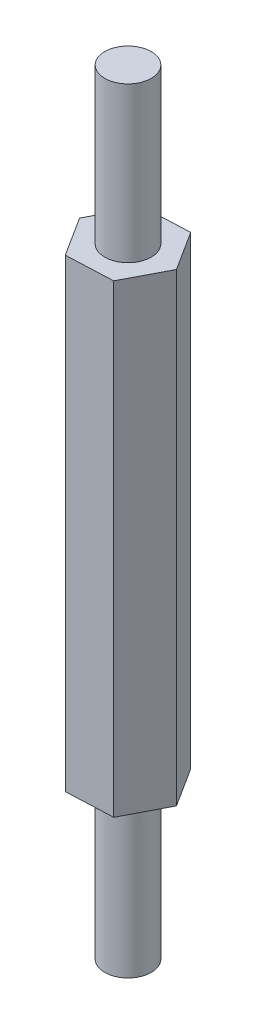
ISO-10303-21;
HEADER;
FILE_DESCRIPTION(('STEP AP214'),'2;1');
FILE_NAME('part.step','',(''),(''),'','','');
FILE_SCHEMA(('AUTOMOTIVE_DESIGN { 1 0 10303 214 1 1 1 1 }'));
ENDSEC;
DATA;
#1=APPLICATION_CONTEXT('core data for automotive mechanical design processes');
#2=APPLICATION_PROTOCOL_DEFINITION('international standard','automotive_design',2000,#1);
#3=PRODUCT_CONTEXT('',#1,'mechanical');
#4=PRODUCT('Part','Part','',(#3));
#5=PRODUCT_RELATED_PRODUCT_CATEGORY('part','',(#4));
#6=PRODUCT_DEFINITION_FORMATION('','',#4);
#7=PRODUCT_DEFINITION_CONTEXT('part definition',#1,'design');
#8=PRODUCT_DEFINITION('design','',#6,#7);
#9=PRODUCT_DEFINITION_SHAPE('','',#8);
#10=(LENGTH_UNIT() NAMED_UNIT(*) SI_UNIT(.MILLI.,.METRE.));
#11=(NAMED_UNIT(*) PLANE_ANGLE_UNIT() SI_UNIT($,.RADIAN.));
#12=(NAMED_UNIT(*) SI_UNIT($,.STERADIAN.) SOLID_ANGLE_UNIT());
#13=UNCERTAINTY_MEASURE_WITH_UNIT(LENGTH_MEASURE(1.E-05),#10,'distance_accuracy_value','');
#14=(GEOMETRIC_REPRESENTATION_CONTEXT(3) GLOBAL_UNCERTAINTY_ASSIGNED_CONTEXT((#13)) GLOBAL_UNIT_ASSIGNED_CONTEXT((#10,
#11,#12)) REPRESENTATION_CONTEXT('',''));
#15=CARTESIAN_POINT('',(0.,0.,0.));
#16=DIRECTION('',(0.,0.,1.));
#17=DIRECTION('',(1.,0.,0.));
#18=AXIS2_PLACEMENT_3D('',#15,#16,#17);
#19=CARTESIAN_POINT('',(0.,0.,0.));
#20=DIRECTION('',(0.,1.,0.));
#21=DIRECTION('',(0.,0.,1.));
#22=AXIS2_PLACEMENT_3D('',#19,#20,#21);
#23=PLANE('',#22);
#24=DIRECTION('',(-0.536521996042108,0.,-0.843886335807727));
#25=VECTOR('',#24,1.);
#26=CARTESIAN_POINT('',(3.,0.,-0.12821246048624));
#27=LINE('',#26,#25);
#28=CARTESIAN_POINT('',(3.,0.,-0.12821246048624));
#29=VERTEX_POINT('',#28);
#30=CARTESIAN_POINT('',(1.38896475213721,0.,-2.66218244159644));
#31=VERTEX_POINT('',#30);
#32=EDGE_CURVE('E119',#29,#31,#27,.T.);
#33=ORIENTED_EDGE('',*,*,#32,.F.);
#34=DIRECTION('',(0.462566006695003,0.,-0.886584846165463));
#35=VECTOR('',#34,1.);
#36=CARTESIAN_POINT('',(1.61103524786279,0.,2.5339699811102));
#37=LINE('',#36,#35);
#38=CARTESIAN_POINT('',(1.61103524786279,0.,2.5339699811102));
#39=VERTEX_POINT('',#38);
#40=EDGE_CURVE('E78',#39,#29,#37,.T.);
#41=ORIENTED_EDGE('',*,*,#40,.F.);
#42=DIRECTION('',(0.999088002737111,0.,-0.0426985103577362));
#43=VECTOR('',#42,1.);
#44=CARTESIAN_POINT('',(-1.38896475213721,0.,2.66218244159644));
#45=LINE('',#44,#43);
#46=CARTESIAN_POINT('',(-1.38896475213721,0.,2.66218244159644));
#47=VERTEX_POINT('',#46);
#48=EDGE_CURVE('E72',#47,#39,#45,.T.);
#49=ORIENTED_EDGE('',*,*,#48,.F.);
#50=DIRECTION('',(0.536521996042108,0.,0.843886335807727));
#51=VECTOR('',#50,1.);
#52=CARTESIAN_POINT('',(-3.,0.,0.12821246048624));
#53=LINE('',#52,#51);
#54=CARTESIAN_POINT('',(-3.,0.,0.12821246048624));
#55=VERTEX_POINT('',#54);
#56=EDGE_CURVE('E109',#55,#47,#53,.T.);
#57=ORIENTED_EDGE('',*,*,#56,.F.);
#58=DIRECTION('',(-0.462566006695003,0.,0.886584846165463));
#59=VECTOR('',#58,1.);
#60=CARTESIAN_POINT('',(-1.61103524786279,0.,-2.5339699811102));
#61=LINE('',#60,#59);
#62=CARTESIAN_POINT('',(-1.61103524786279,0.,-2.5339699811102));
#63=VERTEX_POINT('',#62);
#64=EDGE_CURVE('E125',#63,#55,#61,.T.);
#65=ORIENTED_EDGE('',*,*,#64,.F.);
#66=DIRECTION('',(-0.999088002737111,0.,0.0426985103577361));
#67=VECTOR('',#66,1.);
#68=CARTESIAN_POINT('',(1.38896475213721,0.,-2.66218244159644));
#69=LINE('',#68,#67);
#70=EDGE_CURVE('E122',#31,#63,#69,.T.);
#71=ORIENTED_EDGE('',*,*,#70,.F.);
#72=EDGE_LOOP('',(#33,#41,#49,#57,#65,#71));
#73=FACE_BOUND('',#72,.T.);
#74=CARTESIAN_POINT('',(0.,0.,0.));
#75=DIRECTION('',(0.,1.,0.));
#76=DIRECTION('',(0.,0.,1.));
#77=AXIS2_PLACEMENT_3D('',#74,#75,#76);
#78=CIRCLE('',#77,1.5);
#79=CARTESIAN_POINT('',(0.,0.,1.5));
#80=VERTEX_POINT('',#79);
#81=EDGE_CURVE('E11',#80,#80,#78,.F.);
#82=ORIENTED_EDGE('',*,*,#81,.F.);
#83=EDGE_LOOP('',(#82));
#84=FACE_BOUND('',#83,.T.);
#85=ADVANCED_FACE('F32',(#73,#84),#23,.F.);
#86=CARTESIAN_POINT('',(0.,30.,0.));
#87=DIRECTION('',(0.,1.,0.));
#88=DIRECTION('',(0.,0.,1.));
#89=AXIS2_PLACEMENT_3D('',#86,#87,#88);
#90=PLANE('',#89);
#91=DIRECTION('',(-0.536521996042108,0.,-0.843886335807727));
#92=VECTOR('',#91,1.);
#93=CARTESIAN_POINT('',(3.,30.,-0.12821246048624));
#94=LINE('',#93,#92);
#95=CARTESIAN_POINT('',(3.,30.,-0.12821246048624));
#96=VERTEX_POINT('',#95);
#97=CARTESIAN_POINT('',(1.38896475213721,30.,-2.66218244159644));
#98=VERTEX_POINT('',#97);
#99=EDGE_CURVE('E130',#96,#98,#94,.T.);
#100=ORIENTED_EDGE('',*,*,#99,.T.);
#101=DIRECTION('',(-0.999088002737111,0.,0.0426985103577361));
#102=VECTOR('',#101,1.);
#103=CARTESIAN_POINT('',(1.38896475213721,30.,-2.66218244159644));
#104=LINE('',#103,#102);
#105=CARTESIAN_POINT('',(-1.61103524786279,30.,-2.5339699811102));
#106=VERTEX_POINT('',#105);
#107=EDGE_CURVE('E87',#98,#106,#104,.T.);
#108=ORIENTED_EDGE('',*,*,#107,.T.);
#109=DIRECTION('',(-0.462566006695003,0.,0.886584846165463));
#110=VECTOR('',#109,1.);
#111=CARTESIAN_POINT('',(-1.61103524786279,30.,-2.5339699811102));
#112=LINE('',#111,#110);
#113=CARTESIAN_POINT('',(-3.,30.,0.12821246048624));
#114=VERTEX_POINT('',#113);
#115=EDGE_CURVE('E101',#106,#114,#112,.T.);
#116=ORIENTED_EDGE('',*,*,#115,.T.);
#117=DIRECTION('',(0.536521996042108,0.,0.843886335807727));
#118=VECTOR('',#117,1.);
#119=CARTESIAN_POINT('',(-3.,30.,0.12821246048624));
#120=LINE('',#119,#118);
#121=CARTESIAN_POINT('',(-1.38896475213721,30.,2.66218244159644));
#122=VERTEX_POINT('',#121);
#123=EDGE_CURVE('E94',#114,#122,#120,.T.);
#124=ORIENTED_EDGE('',*,*,#123,.T.);
#125=DIRECTION('',(0.999088002737111,0.,-0.0426985103577362));
#126=VECTOR('',#125,1.);
#127=CARTESIAN_POINT('',(-1.38896475213721,30.,2.66218244159644));
#128=LINE('',#127,#126);
#129=CARTESIAN_POINT('',(1.61103524786279,30.,2.5339699811102));
#130=VERTEX_POINT('',#129);
#131=EDGE_CURVE('E99',#122,#130,#128,.T.);
#132=ORIENTED_EDGE('',*,*,#131,.T.);
#133=DIRECTION('',(0.462566006695003,0.,-0.886584846165463));
#134=VECTOR('',#133,1.);
#135=CARTESIAN_POINT('',(1.61103524786279,30.,2.5339699811102));
#136=LINE('',#135,#134);
#137=EDGE_CURVE('E49',#130,#96,#136,.T.);
#138=ORIENTED_EDGE('',*,*,#137,.T.);
#139=EDGE_LOOP('',(#100,#108,#116,#124,#132,#138));
#140=FACE_BOUND('',#139,.T.);
#141=CARTESIAN_POINT('',(0.,30.,0.));
#142=DIRECTION('',(0.,1.,0.));
#143=DIRECTION('',(0.,0.,1.));
#144=AXIS2_PLACEMENT_3D('',#141,#142,#143);
#145=CIRCLE('',#144,1.5);
#146=CARTESIAN_POINT('',(0.,30.,1.5));
#147=VERTEX_POINT('',#146);
#148=EDGE_CURVE('E149',#147,#147,#145,.T.);
#149=ORIENTED_EDGE('',*,*,#148,.F.);
#150=EDGE_LOOP('',(#149));
#151=FACE_BOUND('',#150,.T.);
#152=ADVANCED_FACE('F96',(#140,#151),#90,.T.);
#153=CARTESIAN_POINT('',(3.,30.,-0.12821246048624));
#154=DIRECTION('',(-0.843886335807727,0.,0.536521996042108));
#155=DIRECTION('',(0.536521996042108,0.,0.843886335807727));
#156=AXIS2_PLACEMENT_3D('',#153,#154,#155);
#157=PLANE('',#156);
#158=ORIENTED_EDGE('',*,*,#32,.T.);
#159=DIRECTION('',(0.,-1.,0.));
#160=VECTOR('',#159,1.);
#161=CARTESIAN_POINT('',(1.38896475213721,30.,-2.66218244159644));
#162=LINE('',#161,#160);
#163=EDGE_CURVE('E41',#98,#31,#162,.T.);
#164=ORIENTED_EDGE('',*,*,#163,.F.);
#165=ORIENTED_EDGE('',*,*,#99,.F.);
#166=DIRECTION('',(0.,-1.,0.));
#167=VECTOR('',#166,1.);
#168=CARTESIAN_POINT('',(3.,30.,-0.12821246048624));
#169=LINE('',#168,#167);
#170=EDGE_CURVE('E115',#96,#29,#169,.T.);
#171=ORIENTED_EDGE('',*,*,#170,.T.);
#172=EDGE_LOOP('',(#158,#164,#165,#171));
#173=FACE_BOUND('',#172,.T.);
#174=ADVANCED_FACE('F34',(#173),#157,.F.);
#175=CARTESIAN_POINT('',(1.38896475213721,30.,-2.66218244159644));
#176=DIRECTION('',(0.0426985103577361,0.,0.999088002737112));
#177=DIRECTION('',(0.999088002737112,0.,-0.0426985103577361));
#178=AXIS2_PLACEMENT_3D('',#175,#176,#177);
#179=PLANE('',#178);
#180=ORIENTED_EDGE('',*,*,#70,.T.);
#181=DIRECTION('',(0.,-1.,0.));
#182=VECTOR('',#181,1.);
#183=CARTESIAN_POINT('',(-1.61103524786279,30.,-2.5339699811102));
#184=LINE('',#183,#182);
#185=EDGE_CURVE('E134',#106,#63,#184,.T.);
#186=ORIENTED_EDGE('',*,*,#185,.F.);
#187=ORIENTED_EDGE('',*,*,#107,.F.);
#188=ORIENTED_EDGE('',*,*,#163,.T.);
#189=EDGE_LOOP('',(#180,#186,#187,#188));
#190=FACE_BOUND('',#189,.T.);
#191=ADVANCED_FACE('F137',(#190),#179,.F.);
#192=CARTESIAN_POINT('',(-1.61103524786279,30.,-2.5339699811102));
#193=DIRECTION('',(0.886584846165463,0.,0.462566006695003));
#194=DIRECTION('',(0.462566006695003,0.,-0.886584846165464));
#195=AXIS2_PLACEMENT_3D('',#192,#193,#194);
#196=PLANE('',#195);
#197=ORIENTED_EDGE('',*,*,#64,.T.);
#198=DIRECTION('',(0.,-1.,0.));
#199=VECTOR('',#198,1.);
#200=CARTESIAN_POINT('',(-3.,30.,0.12821246048624));
#201=LINE('',#200,#199);
#202=EDGE_CURVE('E110',#114,#55,#201,.T.);
#203=ORIENTED_EDGE('',*,*,#202,.F.);
#204=ORIENTED_EDGE('',*,*,#115,.F.);
#205=ORIENTED_EDGE('',*,*,#185,.T.);
#206=EDGE_LOOP('',(#197,#203,#204,#205));
#207=FACE_BOUND('',#206,.T.);
#208=ADVANCED_FACE('F145',(#207),#196,.F.);
#209=CARTESIAN_POINT('',(-3.,30.,0.12821246048624));
#210=DIRECTION('',(0.843886335807727,0.,-0.536521996042108));
#211=DIRECTION('',(-0.536521996042108,0.,-0.843886335807727));
#212=AXIS2_PLACEMENT_3D('',#209,#210,#211);
#213=PLANE('',#212);
#214=ORIENTED_EDGE('',*,*,#56,.T.);
#215=DIRECTION('',(0.,-1.,0.));
#216=VECTOR('',#215,1.);
#217=CARTESIAN_POINT('',(-1.38896475213721,30.,2.66218244159644));
#218=LINE('',#217,#216);
#219=EDGE_CURVE('E106',#122,#47,#218,.T.);
#220=ORIENTED_EDGE('',*,*,#219,.F.);
#221=ORIENTED_EDGE('',*,*,#123,.F.);
#222=ORIENTED_EDGE('',*,*,#202,.T.);
#223=EDGE_LOOP('',(#214,#220,#221,#222));
#224=FACE_BOUND('',#223,.T.);
#225=ADVANCED_FACE('F107',(#224),#213,.F.);
#226=CARTESIAN_POINT('',(-1.38896475213721,30.,2.66218244159644));
#227=DIRECTION('',(-0.0426985103577362,0.,-0.999088002737111));
#228=DIRECTION('',(-0.999088002737111,0.,0.0426985103577362));
#229=AXIS2_PLACEMENT_3D('',#226,#227,#228);
#230=PLANE('',#229);
#231=ORIENTED_EDGE('',*,*,#48,.T.);
#232=DIRECTION('',(0.,-1.,0.));
#233=VECTOR('',#232,1.);
#234=CARTESIAN_POINT('',(1.61103524786279,30.,2.5339699811102));
#235=LINE('',#234,#233);
#236=EDGE_CURVE('E111',#130,#39,#235,.T.);
#237=ORIENTED_EDGE('',*,*,#236,.F.);
#238=ORIENTED_EDGE('',*,*,#131,.F.);
#239=ORIENTED_EDGE('',*,*,#219,.T.);
#240=EDGE_LOOP('',(#231,#237,#238,#239));
#241=FACE_BOUND('',#240,.T.);
#242=ADVANCED_FACE('F113',(#241),#230,.F.);
#243=CARTESIAN_POINT('',(1.61103524786279,30.,2.5339699811102));
#244=DIRECTION('',(-0.886584846165463,0.,-0.462566006695003));
#245=DIRECTION('',(-0.462566006695003,0.,0.886584846165463));
#246=AXIS2_PLACEMENT_3D('',#243,#244,#245);
#247=PLANE('',#246);
#248=ORIENTED_EDGE('',*,*,#40,.T.);
#249=ORIENTED_EDGE('',*,*,#170,.F.);
#250=ORIENTED_EDGE('',*,*,#137,.F.);
#251=ORIENTED_EDGE('',*,*,#236,.T.);
#252=EDGE_LOOP('',(#248,#249,#250,#251));
#253=FACE_BOUND('',#252,.T.);
#254=ADVANCED_FACE('F174',(#253),#247,.F.);
#255=CARTESIAN_POINT('',(0.,40.,0.));
#256=DIRECTION('',(0.,-1.,0.));
#257=DIRECTION('',(0.,0.,-1.));
#258=AXIS2_PLACEMENT_3D('',#255,#256,#257);
#259=CYLINDRICAL_SURFACE('',#258,1.5);
#260=CARTESIAN_POINT('',(0.,40.,0.));
#261=DIRECTION('',(0.,1.,0.));
#262=DIRECTION('',(0.,0.,1.));
#263=AXIS2_PLACEMENT_3D('',#260,#261,#262);
#264=CIRCLE('',#263,1.5);
#265=CARTESIAN_POINT('',(0.,40.,1.5));
#266=VERTEX_POINT('',#265);
#267=EDGE_CURVE('E123',#266,#266,#264,.T.);
#268=ORIENTED_EDGE('',*,*,#267,.F.);
#269=EDGE_LOOP('',(#268));
#270=FACE_BOUND('',#269,.T.);
#271=ORIENTED_EDGE('',*,*,#148,.T.);
#272=EDGE_LOOP('',(#271));
#273=FACE_BOUND('',#272,.T.);
#274=ADVANCED_FACE('F177',(#270,#273),#259,.T.);
#275=CARTESIAN_POINT('',(0.,40.,0.));
#276=DIRECTION('',(0.,1.,0.));
#277=DIRECTION('',(0.,0.,1.));
#278=AXIS2_PLACEMENT_3D('',#275,#276,#277);
#279=PLANE('',#278);
#280=ORIENTED_EDGE('',*,*,#267,.T.);
#281=EDGE_LOOP('',(#280));
#282=FACE_BOUND('',#281,.T.);
#283=ADVANCED_FACE('F163',(#282),#279,.T.);
#284=CARTESIAN_POINT('',(0.,-10.,0.));
#285=DIRECTION('',(0.,1.,0.));
#286=DIRECTION('',(0.,0.,1.));
#287=AXIS2_PLACEMENT_3D('',#284,#285,#286);
#288=CYLINDRICAL_SURFACE('',#287,1.5);
#289=CARTESIAN_POINT('',(0.,-10.,0.));
#290=DIRECTION('',(0.,-1.,0.));
#291=DIRECTION('',(0.,0.,-1.));
#292=AXIS2_PLACEMENT_3D('',#289,#290,#291);
#293=CIRCLE('',#292,1.5);
#294=CARTESIAN_POINT('',(0.,-10.,-1.5));
#295=VERTEX_POINT('',#294);
#296=EDGE_CURVE('E152',#295,#295,#293,.T.);
#297=ORIENTED_EDGE('',*,*,#296,.F.);
#298=EDGE_LOOP('',(#297));
#299=FACE_BOUND('',#298,.T.);
#300=ORIENTED_EDGE('',*,*,#81,.T.);
#301=EDGE_LOOP('',(#300));
#302=FACE_BOUND('',#301,.T.);
#303=ADVANCED_FACE('F160',(#299,#302),#288,.T.);
#304=CARTESIAN_POINT('',(0.,-10.,0.));
#305=DIRECTION('',(0.,-1.,0.));
#306=DIRECTION('',(0.,0.,-1.));
#307=AXIS2_PLACEMENT_3D('',#304,#305,#306);
#308=PLANE('',#307);
#309=ORIENTED_EDGE('',*,*,#296,.T.);
#310=EDGE_LOOP('',(#309));
#311=FACE_BOUND('',#310,.T.);
#312=ADVANCED_FACE('F158',(#311),#308,.T.);
#313=CLOSED_SHELL('',(#85,#152,#174,#191,#208,#225,#242,#254,#274,#283,#303,#312));
#314=MANIFOLD_SOLID_BREP('B2',#313);
#315=ADVANCED_BREP_SHAPE_REPRESENTATION('',(#18,#314),#14);
#316=SHAPE_DEFINITION_REPRESENTATION(#9,#315);
ENDSEC;
END-ISO-10303-21;
